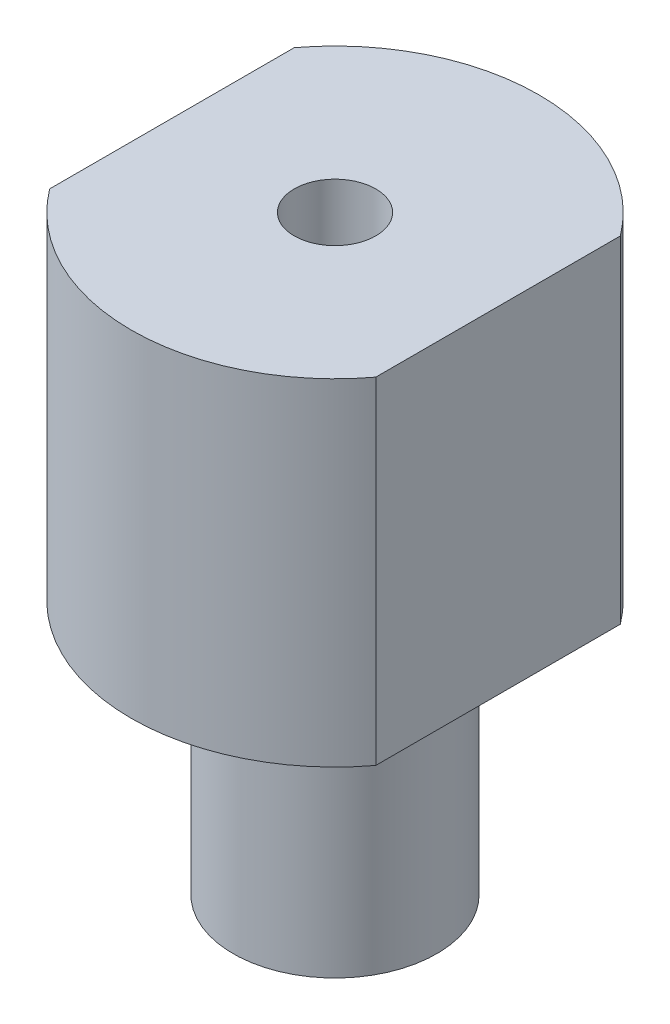
ISO-10303-21;
HEADER;
FILE_DESCRIPTION(('STEP AP214'),'2;1');
FILE_NAME('part.step','',(''),(''),'','','');
FILE_SCHEMA(('AUTOMOTIVE_DESIGN { 1 0 10303 214 1 1 1 1 }'));
ENDSEC;
DATA;
#1=APPLICATION_CONTEXT('core data for automotive mechanical design processes');
#2=APPLICATION_PROTOCOL_DEFINITION('international standard','automotive_design',2000,#1);
#3=PRODUCT_CONTEXT('',#1,'mechanical');
#4=PRODUCT('Part','Part','',(#3));
#5=PRODUCT_RELATED_PRODUCT_CATEGORY('part','',(#4));
#6=PRODUCT_DEFINITION_FORMATION('','',#4);
#7=PRODUCT_DEFINITION_CONTEXT('part definition',#1,'design');
#8=PRODUCT_DEFINITION('design','',#6,#7);
#9=PRODUCT_DEFINITION_SHAPE('','',#8);
#10=(LENGTH_UNIT() NAMED_UNIT(*) SI_UNIT(.MILLI.,.METRE.));
#11=(NAMED_UNIT(*) PLANE_ANGLE_UNIT() SI_UNIT($,.RADIAN.));
#12=(NAMED_UNIT(*) SI_UNIT($,.STERADIAN.) SOLID_ANGLE_UNIT());
#13=UNCERTAINTY_MEASURE_WITH_UNIT(LENGTH_MEASURE(1.E-05),#10,'distance_accuracy_value','');
#14=(GEOMETRIC_REPRESENTATION_CONTEXT(3) GLOBAL_UNCERTAINTY_ASSIGNED_CONTEXT((#13)) GLOBAL_UNIT_ASSIGNED_CONTEXT((#10,
#11,#12)) REPRESENTATION_CONTEXT('',''));
#15=CARTESIAN_POINT('',(0.,0.,0.));
#16=DIRECTION('',(0.,0.,1.));
#17=DIRECTION('',(1.,0.,0.));
#18=AXIS2_PLACEMENT_3D('',#15,#16,#17);
#19=CARTESIAN_POINT('',(0.,33.,0.));
#20=DIRECTION('',(0.,-1.,0.));
#21=DIRECTION('',(0.,0.,-1.));
#22=AXIS2_PLACEMENT_3D('',#19,#20,#21);
#23=CYLINDRICAL_SURFACE('',#22,20.);
#24=CARTESIAN_POINT('',(0.,0.,0.));
#25=DIRECTION('',(0.,1.,0.));
#26=DIRECTION('',(0.,0.,1.));
#27=AXIS2_PLACEMENT_3D('',#24,#25,#26);
#28=CIRCLE('',#27,20.);
#29=CARTESIAN_POINT('',(16.,0.,-12.));
#30=VERTEX_POINT('',#29);
#31=CARTESIAN_POINT('',(-16.,0.,-12.));
#32=VERTEX_POINT('',#31);
#33=EDGE_CURVE('E110',#30,#32,#28,.T.);
#34=ORIENTED_EDGE('',*,*,#33,.T.);
#35=DIRECTION('',(0.,-1.,0.));
#36=VECTOR('',#35,1.);
#37=CARTESIAN_POINT('',(-16.,33.,-12.));
#38=LINE('',#37,#36);
#39=CARTESIAN_POINT('',(-16.,33.,-12.));
#40=VERTEX_POINT('',#39);
#41=EDGE_CURVE('E42',#40,#32,#38,.T.);
#42=ORIENTED_EDGE('',*,*,#41,.F.);
#43=CARTESIAN_POINT('',(0.,33.,0.));
#44=DIRECTION('',(0.,1.,0.));
#45=DIRECTION('',(0.,0.,1.));
#46=AXIS2_PLACEMENT_3D('',#43,#44,#45);
#47=CIRCLE('',#46,20.);
#48=CARTESIAN_POINT('',(16.,33.,-12.));
#49=VERTEX_POINT('',#48);
#50=EDGE_CURVE('E93',#49,#40,#47,.T.);
#51=ORIENTED_EDGE('',*,*,#50,.F.);
#52=DIRECTION('',(0.,-1.,0.));
#53=VECTOR('',#52,1.);
#54=CARTESIAN_POINT('',(16.,33.,-12.));
#55=LINE('',#54,#53);
#56=EDGE_CURVE('E106',#49,#30,#55,.T.);
#57=ORIENTED_EDGE('',*,*,#56,.T.);
#58=EDGE_LOOP('',(#34,#42,#51,#57));
#59=FACE_BOUND('',#58,.T.);
#60=ADVANCED_FACE('F39',(#59),#23,.T.);
#61=CARTESIAN_POINT('',(-16.,33.,-12.));
#62=DIRECTION('',(1.,0.,0.));
#63=DIRECTION('',(0.,0.,-1.));
#64=AXIS2_PLACEMENT_3D('',#61,#62,#63);
#65=PLANE('',#64);
#66=DIRECTION('',(0.,0.,1.));
#67=VECTOR('',#66,1.);
#68=CARTESIAN_POINT('',(-16.,0.,-12.));
#69=LINE('',#68,#67);
#70=CARTESIAN_POINT('',(-16.,0.,12.));
#71=VERTEX_POINT('',#70);
#72=EDGE_CURVE('E99',#32,#71,#69,.T.);
#73=ORIENTED_EDGE('',*,*,#72,.T.);
#74=DIRECTION('',(0.,-1.,0.));
#75=VECTOR('',#74,1.);
#76=CARTESIAN_POINT('',(-16.,33.,12.));
#77=LINE('',#76,#75);
#78=CARTESIAN_POINT('',(-16.,33.,12.));
#79=VERTEX_POINT('',#78);
#80=EDGE_CURVE('E97',#79,#71,#77,.T.);
#81=ORIENTED_EDGE('',*,*,#80,.F.);
#82=DIRECTION('',(0.,0.,1.));
#83=VECTOR('',#82,1.);
#84=CARTESIAN_POINT('',(-16.,33.,-12.));
#85=LINE('',#84,#83);
#86=EDGE_CURVE('E88',#40,#79,#85,.T.);
#87=ORIENTED_EDGE('',*,*,#86,.F.);
#88=ORIENTED_EDGE('',*,*,#41,.T.);
#89=EDGE_LOOP('',(#73,#81,#87,#88));
#90=FACE_BOUND('',#89,.T.);
#91=ADVANCED_FACE('F98',(#90),#65,.F.);
#92=CARTESIAN_POINT('',(0.,33.,0.));
#93=DIRECTION('',(0.,-1.,0.));
#94=DIRECTION('',(0.,0.,-1.));
#95=AXIS2_PLACEMENT_3D('',#92,#93,#94);
#96=CYLINDRICAL_SURFACE('',#95,20.);
#97=CARTESIAN_POINT('',(0.,0.,0.));
#98=DIRECTION('',(0.,1.,0.));
#99=DIRECTION('',(0.,0.,1.));
#100=AXIS2_PLACEMENT_3D('',#97,#98,#99);
#101=CIRCLE('',#100,20.);
#102=CARTESIAN_POINT('',(16.,0.,12.));
#103=VERTEX_POINT('',#102);
#104=EDGE_CURVE('E74',#71,#103,#101,.T.);
#105=ORIENTED_EDGE('',*,*,#104,.T.);
#106=DIRECTION('',(0.,-1.,0.));
#107=VECTOR('',#106,1.);
#108=CARTESIAN_POINT('',(16.,33.,12.));
#109=LINE('',#108,#107);
#110=CARTESIAN_POINT('',(16.,33.,12.));
#111=VERTEX_POINT('',#110);
#112=EDGE_CURVE('E101',#111,#103,#109,.T.);
#113=ORIENTED_EDGE('',*,*,#112,.F.);
#114=CARTESIAN_POINT('',(0.,33.,0.));
#115=DIRECTION('',(0.,1.,0.));
#116=DIRECTION('',(0.,0.,1.));
#117=AXIS2_PLACEMENT_3D('',#114,#115,#116);
#118=CIRCLE('',#117,20.);
#119=EDGE_CURVE('E91',#79,#111,#118,.T.);
#120=ORIENTED_EDGE('',*,*,#119,.F.);
#121=ORIENTED_EDGE('',*,*,#80,.T.);
#122=EDGE_LOOP('',(#105,#113,#120,#121));
#123=FACE_BOUND('',#122,.T.);
#124=ADVANCED_FACE('F102',(#123),#96,.T.);
#125=CARTESIAN_POINT('',(16.,33.,-12.));
#126=DIRECTION('',(-1.,0.,0.));
#127=DIRECTION('',(0.,0.,1.));
#128=AXIS2_PLACEMENT_3D('',#125,#126,#127);
#129=PLANE('',#128);
#130=DIRECTION('',(0.,0.,-1.));
#131=VECTOR('',#130,1.);
#132=CARTESIAN_POINT('',(16.,0.,-12.));
#133=LINE('',#132,#131);
#134=EDGE_CURVE('E80',#103,#30,#133,.T.);
#135=ORIENTED_EDGE('',*,*,#134,.T.);
#136=ORIENTED_EDGE('',*,*,#56,.F.);
#137=DIRECTION('',(0.,0.,-1.));
#138=VECTOR('',#137,1.);
#139=CARTESIAN_POINT('',(16.,33.,-12.));
#140=LINE('',#139,#138);
#141=EDGE_CURVE('E57',#111,#49,#140,.T.);
#142=ORIENTED_EDGE('',*,*,#141,.F.);
#143=ORIENTED_EDGE('',*,*,#112,.T.);
#144=EDGE_LOOP('',(#135,#136,#142,#143));
#145=FACE_BOUND('',#144,.T.);
#146=ADVANCED_FACE('F124',(#145),#129,.F.);
#147=CARTESIAN_POINT('',(0.,33.,0.));
#148=DIRECTION('',(0.,1.,0.));
#149=DIRECTION('',(0.,0.,1.));
#150=AXIS2_PLACEMENT_3D('',#147,#148,#149);
#151=PLANE('',#150);
#152=CARTESIAN_POINT('',(0.,33.,0.));
#153=DIRECTION('',(0.,1.,0.));
#154=DIRECTION('',(0.,0.,1.));
#155=AXIS2_PLACEMENT_3D('',#152,#153,#154);
#156=CIRCLE('',#155,4.);
#157=CARTESIAN_POINT('',(0.,33.,4.));
#158=VERTEX_POINT('',#157);
#159=EDGE_CURVE('E135',#158,#158,#156,.T.);
#160=ORIENTED_EDGE('',*,*,#159,.F.);
#161=EDGE_LOOP('',(#160));
#162=FACE_BOUND('',#161,.T.);
#163=ORIENTED_EDGE('',*,*,#50,.T.);
#164=ORIENTED_EDGE('',*,*,#86,.T.);
#165=ORIENTED_EDGE('',*,*,#119,.T.);
#166=ORIENTED_EDGE('',*,*,#141,.T.);
#167=EDGE_LOOP('',(#163,#164,#165,#166));
#168=FACE_BOUND('',#167,.T.);
#169=ADVANCED_FACE('F89',(#162,#168),#151,.T.);
#170=CARTESIAN_POINT('',(0.,0.,0.));
#171=DIRECTION('',(0.,1.,0.));
#172=DIRECTION('',(0.,0.,1.));
#173=AXIS2_PLACEMENT_3D('',#170,#171,#172);
#174=PLANE('',#173);
#175=CARTESIAN_POINT('',(0.,0.,0.));
#176=DIRECTION('',(0.,-1.,0.));
#177=DIRECTION('',(0.,0.,-1.));
#178=AXIS2_PLACEMENT_3D('',#175,#176,#177);
#179=CIRCLE('',#178,10.);
#180=CARTESIAN_POINT('',(0.,0.,-10.));
#181=VERTEX_POINT('',#180);
#182=EDGE_CURVE('E11',#181,#181,#179,.T.);
#183=ORIENTED_EDGE('',*,*,#182,.F.);
#184=EDGE_LOOP('',(#183));
#185=FACE_BOUND('',#184,.T.);
#186=ORIENTED_EDGE('',*,*,#33,.F.);
#187=ORIENTED_EDGE('',*,*,#134,.F.);
#188=ORIENTED_EDGE('',*,*,#104,.F.);
#189=ORIENTED_EDGE('',*,*,#72,.F.);
#190=EDGE_LOOP('',(#186,#187,#188,#189));
#191=FACE_BOUND('',#190,.T.);
#192=ADVANCED_FACE('F127',(#185,#191),#174,.F.);
#193=CARTESIAN_POINT('',(0.,-25.,0.));
#194=DIRECTION('',(0.,1.,0.));
#195=DIRECTION('',(0.,0.,1.));
#196=AXIS2_PLACEMENT_3D('',#193,#194,#195);
#197=CYLINDRICAL_SURFACE('',#196,10.);
#198=CARTESIAN_POINT('',(0.,-25.,0.));
#199=DIRECTION('',(0.,-1.,0.));
#200=DIRECTION('',(0.,0.,-1.));
#201=AXIS2_PLACEMENT_3D('',#198,#199,#200);
#202=CIRCLE('',#201,10.);
#203=CARTESIAN_POINT('',(0.,-25.,-10.));
#204=VERTEX_POINT('',#203);
#205=EDGE_CURVE('E114',#204,#204,#202,.T.);
#206=ORIENTED_EDGE('',*,*,#205,.F.);
#207=EDGE_LOOP('',(#206));
#208=FACE_BOUND('',#207,.T.);
#209=ORIENTED_EDGE('',*,*,#182,.T.);
#210=EDGE_LOOP('',(#209));
#211=FACE_BOUND('',#210,.T.);
#212=ADVANCED_FACE('F164',(#208,#211),#197,.T.);
#213=CARTESIAN_POINT('',(0.,-25.,0.));
#214=DIRECTION('',(0.,-1.,0.));
#215=DIRECTION('',(0.,0.,-1.));
#216=AXIS2_PLACEMENT_3D('',#213,#214,#215);
#217=PLANE('',#216);
#218=CARTESIAN_POINT('',(0.,-25.,0.));
#219=DIRECTION('',(0.,-1.,0.));
#220=DIRECTION('',(0.,0.,-1.));
#221=AXIS2_PLACEMENT_3D('',#218,#219,#220);
#222=CIRCLE('',#221,3.46188381017725);
#223=CARTESIAN_POINT('',(0.,-25.,-3.46188381017725));
#224=VERTEX_POINT('',#223);
#225=EDGE_CURVE('E143',#224,#224,#222,.T.);
#226=ORIENTED_EDGE('',*,*,#225,.F.);
#227=EDGE_LOOP('',(#226));
#228=FACE_BOUND('',#227,.T.);
#229=ORIENTED_EDGE('',*,*,#205,.T.);
#230=EDGE_LOOP('',(#229));
#231=FACE_BOUND('',#230,.T.);
#232=ADVANCED_FACE('F160',(#228,#231),#217,.T.);
#233=CARTESIAN_POINT('',(0.,25.,0.));
#234=DIRECTION('',(0.,1.,0.));
#235=DIRECTION('',(0.,0.,1.));
#236=AXIS2_PLACEMENT_3D('',#233,#234,#235);
#237=CYLINDRICAL_SURFACE('',#236,4.);
#238=CARTESIAN_POINT('',(0.,25.,0.));
#239=DIRECTION('',(0.,1.,0.));
#240=DIRECTION('',(0.,0.,1.));
#241=AXIS2_PLACEMENT_3D('',#238,#239,#240);
#242=CIRCLE('',#241,4.);
#243=CARTESIAN_POINT('',(0.,25.,4.));
#244=VERTEX_POINT('',#243);
#245=EDGE_CURVE('E134',#244,#244,#242,.T.);
#246=ORIENTED_EDGE('',*,*,#245,.F.);
#247=EDGE_LOOP('',(#246));
#248=FACE_BOUND('',#247,.T.);
#249=ORIENTED_EDGE('',*,*,#159,.T.);
#250=EDGE_LOOP('',(#249));
#251=FACE_BOUND('',#250,.T.);
#252=ADVANCED_FACE('F163',(#248,#251),#237,.F.);
#253=CARTESIAN_POINT('',(0.,25.,0.));
#254=DIRECTION('',(0.,1.,0.));
#255=DIRECTION('',(0.,0.,1.));
#256=AXIS2_PLACEMENT_3D('',#253,#254,#255);
#257=PLANE('',#256);
#258=ORIENTED_EDGE('',*,*,#245,.T.);
#259=EDGE_LOOP('',(#258));
#260=FACE_BOUND('',#259,.T.);
#261=ADVANCED_FACE('F156',(#260),#257,.T.);
#262=CARTESIAN_POINT('',(0.,0.,0.));
#263=DIRECTION('',(0.,-1.,0.));
#264=DIRECTION('',(0.,0.,-1.));
#265=AXIS2_PLACEMENT_3D('',#262,#263,#264);
#266=CYLINDRICAL_SURFACE('',#265,3.46188381017725);
#267=CARTESIAN_POINT('',(0.,0.,0.));
#268=DIRECTION('',(0.,-1.,0.));
#269=DIRECTION('',(0.,0.,-1.));
#270=AXIS2_PLACEMENT_3D('',#267,#268,#269);
#271=CIRCLE('',#270,3.46188381017725);
#272=CARTESIAN_POINT('',(0.,0.,-3.46188381017725));
#273=VERTEX_POINT('',#272);
#274=EDGE_CURVE('E139',#273,#273,#271,.T.);
#275=ORIENTED_EDGE('',*,*,#274,.F.);
#276=EDGE_LOOP('',(#275));
#277=FACE_BOUND('',#276,.T.);
#278=ORIENTED_EDGE('',*,*,#225,.T.);
#279=EDGE_LOOP('',(#278));
#280=FACE_BOUND('',#279,.T.);
#281=ADVANCED_FACE('F153',(#277,#280),#266,.F.);
#282=CARTESIAN_POINT('',(0.,0.,0.));
#283=DIRECTION('',(0.,-1.,0.));
#284=DIRECTION('',(0.,0.,-1.));
#285=AXIS2_PLACEMENT_3D('',#282,#283,#284);
#286=PLANE('',#285);
#287=ORIENTED_EDGE('',*,*,#274,.T.);
#288=EDGE_LOOP('',(#287));
#289=FACE_BOUND('',#288,.T.);
#290=ADVANCED_FACE('F151',(#289),#286,.T.);
#291=CLOSED_SHELL('',(#60,#91,#124,#146,#169,#192,#212,#232,#252,#261,#281,#290));
#292=MANIFOLD_SOLID_BREP('B2',#291);
#293=ADVANCED_BREP_SHAPE_REPRESENTATION('',(#18,#292),#14);
#294=SHAPE_DEFINITION_REPRESENTATION(#9,#293);
ENDSEC;
END-ISO-10303-21;
